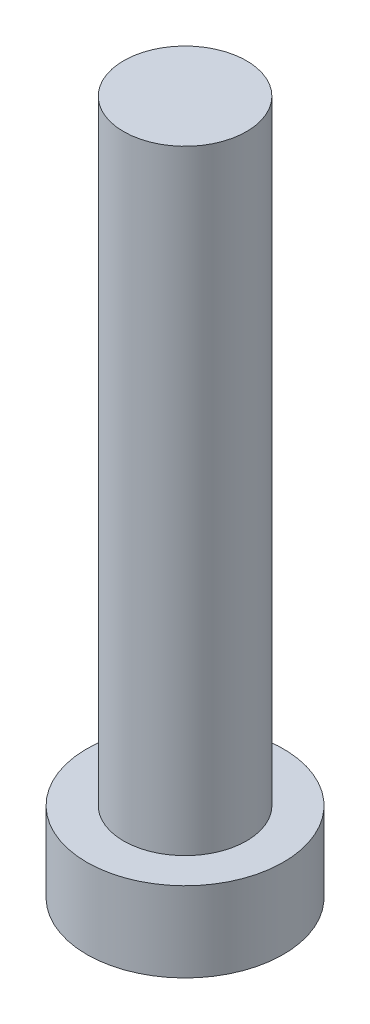
ISO-10303-21;
HEADER;
FILE_DESCRIPTION(('STEP AP214'),'2;1');
FILE_NAME('part.step','',(''),(''),'','','');
FILE_SCHEMA(('AUTOMOTIVE_DESIGN { 1 0 10303 214 1 1 1 1 }'));
ENDSEC;
DATA;
#1=APPLICATION_CONTEXT('core data for automotive mechanical design processes');
#2=APPLICATION_PROTOCOL_DEFINITION('international standard','automotive_design',2000,#1);
#3=PRODUCT_CONTEXT('',#1,'mechanical');
#4=PRODUCT('Part','Part','',(#3));
#5=PRODUCT_RELATED_PRODUCT_CATEGORY('part','',(#4));
#6=PRODUCT_DEFINITION_FORMATION('','',#4);
#7=PRODUCT_DEFINITION_CONTEXT('part definition',#1,'design');
#8=PRODUCT_DEFINITION('design','',#6,#7);
#9=PRODUCT_DEFINITION_SHAPE('','',#8);
#10=(LENGTH_UNIT() NAMED_UNIT(*) SI_UNIT(.MILLI.,.METRE.));
#11=(NAMED_UNIT(*) PLANE_ANGLE_UNIT() SI_UNIT($,.RADIAN.));
#12=(NAMED_UNIT(*) SI_UNIT($,.STERADIAN.) SOLID_ANGLE_UNIT());
#13=UNCERTAINTY_MEASURE_WITH_UNIT(LENGTH_MEASURE(1.E-05),#10,'distance_accuracy_value','');
#14=(GEOMETRIC_REPRESENTATION_CONTEXT(3) GLOBAL_UNCERTAINTY_ASSIGNED_CONTEXT((#13)) GLOBAL_UNIT_ASSIGNED_CONTEXT((#10,
#11,#12)) REPRESENTATION_CONTEXT('',''));
#15=CARTESIAN_POINT('',(0.,0.,0.));
#16=DIRECTION('',(0.,0.,1.));
#17=DIRECTION('',(1.,0.,0.));
#18=AXIS2_PLACEMENT_3D('',#15,#16,#17);
#19=CARTESIAN_POINT('',(0.,1.3,0.));
#20=DIRECTION('',(0.,-1.,0.));
#21=DIRECTION('',(0.,0.,-1.));
#22=AXIS2_PLACEMENT_3D('',#19,#20,#21);
#23=CYLINDRICAL_SURFACE('',#22,1.6);
#24=CARTESIAN_POINT('',(0.,1.3,0.));
#25=DIRECTION('',(0.,1.,0.));
#26=DIRECTION('',(0.,0.,1.));
#27=AXIS2_PLACEMENT_3D('',#24,#25,#26);
#28=CIRCLE('',#27,1.6);
#29=CARTESIAN_POINT('',(0.,1.3,1.6));
#30=VERTEX_POINT('',#29);
#31=EDGE_CURVE('E45',#30,#30,#28,.T.);
#32=ORIENTED_EDGE('',*,*,#31,.F.);
#33=EDGE_LOOP('',(#32));
#34=FACE_BOUND('',#33,.T.);
#35=CARTESIAN_POINT('',(0.,0.,0.));
#36=DIRECTION('',(0.,1.,0.));
#37=DIRECTION('',(0.,0.,1.));
#38=AXIS2_PLACEMENT_3D('',#35,#36,#37);
#39=CIRCLE('',#38,1.6);
#40=CARTESIAN_POINT('',(0.,0.,1.6));
#41=VERTEX_POINT('',#40);
#42=EDGE_CURVE('E40',#41,#41,#39,.T.);
#43=ORIENTED_EDGE('',*,*,#42,.T.);
#44=EDGE_LOOP('',(#43));
#45=FACE_BOUND('',#44,.T.);
#46=ADVANCED_FACE('F37',(#34,#45),#23,.T.);
#47=CARTESIAN_POINT('',(0.,1.3,0.));
#48=DIRECTION('',(0.,1.,0.));
#49=DIRECTION('',(0.,0.,1.));
#50=AXIS2_PLACEMENT_3D('',#47,#48,#49);
#51=PLANE('',#50);
#52=CARTESIAN_POINT('',(0.,1.3,0.));
#53=DIRECTION('',(0.,1.,0.));
#54=DIRECTION('',(0.,0.,1.));
#55=AXIS2_PLACEMENT_3D('',#52,#53,#54);
#56=CIRCLE('',#55,1.);
#57=CARTESIAN_POINT('',(0.,1.3,1.));
#58=VERTEX_POINT('',#57);
#59=EDGE_CURVE('E10',#58,#58,#56,.T.);
#60=ORIENTED_EDGE('',*,*,#59,.F.);
#61=EDGE_LOOP('',(#60));
#62=FACE_BOUND('',#61,.T.);
#63=ORIENTED_EDGE('',*,*,#31,.T.);
#64=EDGE_LOOP('',(#63));
#65=FACE_BOUND('',#64,.T.);
#66=ADVANCED_FACE('F65',(#62,#65),#51,.T.);
#67=CARTESIAN_POINT('',(0.,0.,0.));
#68=DIRECTION('',(0.,1.,0.));
#69=DIRECTION('',(0.,0.,1.));
#70=AXIS2_PLACEMENT_3D('',#67,#68,#69);
#71=PLANE('',#70);
#72=ORIENTED_EDGE('',*,*,#42,.F.);
#73=EDGE_LOOP('',(#72));
#74=FACE_BOUND('',#73,.T.);
#75=ADVANCED_FACE('F62',(#74),#71,.F.);
#76=CARTESIAN_POINT('',(0.,11.3,0.));
#77=DIRECTION('',(0.,-1.,0.));
#78=DIRECTION('',(0.,0.,-1.));
#79=AXIS2_PLACEMENT_3D('',#76,#77,#78);
#80=CYLINDRICAL_SURFACE('',#79,1.);
#81=CARTESIAN_POINT('',(0.,11.3,0.));
#82=DIRECTION('',(0.,1.,0.));
#83=DIRECTION('',(0.,0.,1.));
#84=AXIS2_PLACEMENT_3D('',#81,#82,#83);
#85=CIRCLE('',#84,1.);
#86=CARTESIAN_POINT('',(0.,11.3,1.));
#87=VERTEX_POINT('',#86);
#88=EDGE_CURVE('E52',#87,#87,#85,.T.);
#89=ORIENTED_EDGE('',*,*,#88,.F.);
#90=EDGE_LOOP('',(#89));
#91=FACE_BOUND('',#90,.T.);
#92=ORIENTED_EDGE('',*,*,#59,.T.);
#93=EDGE_LOOP('',(#92));
#94=FACE_BOUND('',#93,.T.);
#95=ADVANCED_FACE('F64',(#91,#94),#80,.T.);
#96=CARTESIAN_POINT('',(0.,11.3,0.));
#97=DIRECTION('',(0.,1.,0.));
#98=DIRECTION('',(0.,0.,1.));
#99=AXIS2_PLACEMENT_3D('',#96,#97,#98);
#100=PLANE('',#99);
#101=ORIENTED_EDGE('',*,*,#88,.T.);
#102=EDGE_LOOP('',(#101));
#103=FACE_BOUND('',#102,.T.);
#104=ADVANCED_FACE('F70',(#103),#100,.T.);
#105=CLOSED_SHELL('',(#46,#66,#75,#95,#104));
#106=MANIFOLD_SOLID_BREP('B2',#105);
#107=ADVANCED_BREP_SHAPE_REPRESENTATION('',(#18,#106),#14);
#108=SHAPE_DEFINITION_REPRESENTATION(#9,#107);
ENDSEC;
END-ISO-10303-21;
